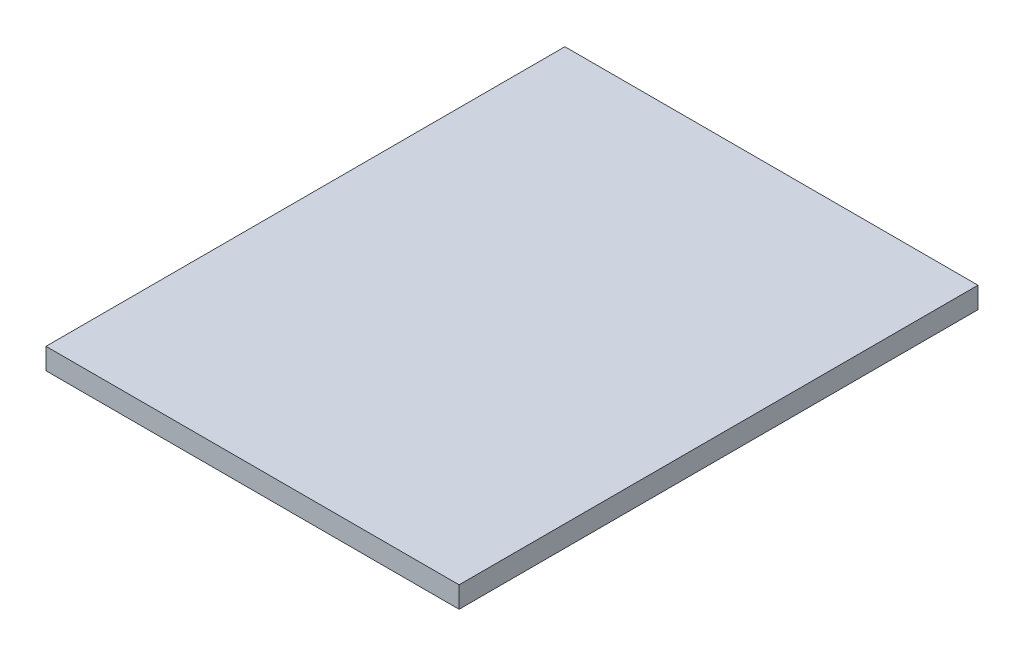
ISO-10303-21;
HEADER;
FILE_DESCRIPTION(('STEP AP214'),'2;1');
FILE_NAME('part.step','',(''),(''),'','','');
FILE_SCHEMA(('AUTOMOTIVE_DESIGN { 1 0 10303 214 1 1 1 1 }'));
ENDSEC;
DATA;
#1=APPLICATION_CONTEXT('core data for automotive mechanical design processes');
#2=APPLICATION_PROTOCOL_DEFINITION('international standard','automotive_design',2000,#1);
#3=PRODUCT_CONTEXT('',#1,'mechanical');
#4=PRODUCT('Part','Part','',(#3));
#5=PRODUCT_RELATED_PRODUCT_CATEGORY('part','',(#4));
#6=PRODUCT_DEFINITION_FORMATION('','',#4);
#7=PRODUCT_DEFINITION_CONTEXT('part definition',#1,'design');
#8=PRODUCT_DEFINITION('design','',#6,#7);
#9=PRODUCT_DEFINITION_SHAPE('','',#8);
#10=(LENGTH_UNIT() NAMED_UNIT(*) SI_UNIT(.MILLI.,.METRE.));
#11=(NAMED_UNIT(*) PLANE_ANGLE_UNIT() SI_UNIT($,.RADIAN.));
#12=(NAMED_UNIT(*) SI_UNIT($,.STERADIAN.) SOLID_ANGLE_UNIT());
#13=UNCERTAINTY_MEASURE_WITH_UNIT(LENGTH_MEASURE(1.E-05),#10,'distance_accuracy_value','');
#14=(GEOMETRIC_REPRESENTATION_CONTEXT(3) GLOBAL_UNCERTAINTY_ASSIGNED_CONTEXT((#13)) GLOBAL_UNIT_ASSIGNED_CONTEXT((#10,
#11,#12)) REPRESENTATION_CONTEXT('',''));
#15=CARTESIAN_POINT('',(0.,0.,0.));
#16=DIRECTION('',(0.,0.,1.));
#17=DIRECTION('',(1.,0.,0.));
#18=AXIS2_PLACEMENT_3D('',#15,#16,#17);
#19=CARTESIAN_POINT('',(-134.737910668143,19.,-163.416666666667));
#20=DIRECTION('',(1.,0.,0.));
#21=DIRECTION('',(0.,0.,-1.));
#22=AXIS2_PLACEMENT_3D('',#19,#20,#21);
#23=PLANE('',#22);
#24=DIRECTION('',(0.,0.,1.));
#25=VECTOR('',#24,1.);
#26=CARTESIAN_POINT('',(-134.737910668143,0.,-163.416666666667));
#27=LINE('',#26,#25);
#28=CARTESIAN_POINT('',(-134.737910668143,0.,-163.416666666667));
#29=VERTEX_POINT('',#28);
#30=CARTESIAN_POINT('',(-134.737910668143,0.,301.363333333333));
#31=VERTEX_POINT('',#30);
#32=EDGE_CURVE('E96',#29,#31,#27,.T.);
#33=ORIENTED_EDGE('',*,*,#32,.T.);
#34=DIRECTION('',(0.,-1.,0.));
#35=VECTOR('',#34,1.);
#36=CARTESIAN_POINT('',(-134.737910668143,19.,301.363333333333));
#37=LINE('',#36,#35);
#38=CARTESIAN_POINT('',(-134.737910668143,19.,301.363333333333));
#39=VERTEX_POINT('',#38);
#40=EDGE_CURVE('E11',#39,#31,#37,.T.);
#41=ORIENTED_EDGE('',*,*,#40,.F.);
#42=DIRECTION('',(0.,0.,1.));
#43=VECTOR('',#42,1.);
#44=CARTESIAN_POINT('',(-134.737910668143,19.,-163.416666666667));
#45=LINE('',#44,#43);
#46=CARTESIAN_POINT('',(-134.737910668143,19.,-163.416666666667));
#47=VERTEX_POINT('',#46);
#48=EDGE_CURVE('E84',#47,#39,#45,.T.);
#49=ORIENTED_EDGE('',*,*,#48,.F.);
#50=DIRECTION('',(0.,-1.,0.));
#51=VECTOR('',#50,1.);
#52=CARTESIAN_POINT('',(-134.737910668143,19.,-163.416666666667));
#53=LINE('',#52,#51);
#54=EDGE_CURVE('E92',#47,#29,#53,.T.);
#55=ORIENTED_EDGE('',*,*,#54,.T.);
#56=EDGE_LOOP('',(#33,#41,#49,#55));
#57=FACE_BOUND('',#56,.T.);
#58=ADVANCED_FACE('F33',(#57),#23,.F.);
#59=CARTESIAN_POINT('',(-134.737910668143,19.,301.363333333333));
#60=DIRECTION('',(0.,0.,-1.));
#61=DIRECTION('',(-1.,0.,0.));
#62=AXIS2_PLACEMENT_3D('',#59,#60,#61);
#63=PLANE('',#62);
#64=DIRECTION('',(1.,0.,0.));
#65=VECTOR('',#64,1.);
#66=CARTESIAN_POINT('',(-134.737910668143,0.,301.363333333333));
#67=LINE('',#66,#65);
#68=CARTESIAN_POINT('',(235.262089331857,0.,301.363333333333));
#69=VERTEX_POINT('',#68);
#70=EDGE_CURVE('E88',#31,#69,#67,.T.);
#71=ORIENTED_EDGE('',*,*,#70,.T.);
#72=DIRECTION('',(0.,-1.,0.));
#73=VECTOR('',#72,1.);
#74=CARTESIAN_POINT('',(235.262089331857,19.,301.363333333333));
#75=LINE('',#74,#73);
#76=CARTESIAN_POINT('',(235.262089331857,19.,301.363333333333));
#77=VERTEX_POINT('',#76);
#78=EDGE_CURVE('E41',#77,#69,#75,.T.);
#79=ORIENTED_EDGE('',*,*,#78,.F.);
#80=DIRECTION('',(1.,0.,0.));
#81=VECTOR('',#80,1.);
#82=CARTESIAN_POINT('',(-134.737910668143,19.,301.363333333333));
#83=LINE('',#82,#81);
#84=EDGE_CURVE('E79',#39,#77,#83,.T.);
#85=ORIENTED_EDGE('',*,*,#84,.F.);
#86=ORIENTED_EDGE('',*,*,#40,.T.);
#87=EDGE_LOOP('',(#71,#79,#85,#86));
#88=FACE_BOUND('',#87,.T.);
#89=ADVANCED_FACE('F87',(#88),#63,.F.);
#90=CARTESIAN_POINT('',(235.262089331857,19.,-163.416666666667));
#91=DIRECTION('',(-1.,0.,0.));
#92=DIRECTION('',(0.,0.,1.));
#93=AXIS2_PLACEMENT_3D('',#90,#91,#92);
#94=PLANE('',#93);
#95=DIRECTION('',(0.,0.,-1.));
#96=VECTOR('',#95,1.);
#97=CARTESIAN_POINT('',(235.262089331857,0.,-163.416666666667));
#98=LINE('',#97,#96);
#99=CARTESIAN_POINT('',(235.262089331857,0.,-163.416666666667));
#100=VERTEX_POINT('',#99);
#101=EDGE_CURVE('E66',#69,#100,#98,.T.);
#102=ORIENTED_EDGE('',*,*,#101,.T.);
#103=DIRECTION('',(0.,-1.,0.));
#104=VECTOR('',#103,1.);
#105=CARTESIAN_POINT('',(235.262089331857,19.,-163.416666666667));
#106=LINE('',#105,#104);
#107=CARTESIAN_POINT('',(235.262089331857,19.,-163.416666666667));
#108=VERTEX_POINT('',#107);
#109=EDGE_CURVE('E89',#108,#100,#106,.T.);
#110=ORIENTED_EDGE('',*,*,#109,.F.);
#111=DIRECTION('',(0.,0.,-1.));
#112=VECTOR('',#111,1.);
#113=CARTESIAN_POINT('',(235.262089331857,19.,-163.416666666667));
#114=LINE('',#113,#112);
#115=EDGE_CURVE('E82',#77,#108,#114,.T.);
#116=ORIENTED_EDGE('',*,*,#115,.F.);
#117=ORIENTED_EDGE('',*,*,#78,.T.);
#118=EDGE_LOOP('',(#102,#110,#116,#117));
#119=FACE_BOUND('',#118,.T.);
#120=ADVANCED_FACE('F90',(#119),#94,.F.);
#121=CARTESIAN_POINT('',(-134.737910668143,19.,-163.416666666667));
#122=DIRECTION('',(0.,0.,1.));
#123=DIRECTION('',(1.,0.,0.));
#124=AXIS2_PLACEMENT_3D('',#121,#122,#123);
#125=PLANE('',#124);
#126=DIRECTION('',(-1.,0.,0.));
#127=VECTOR('',#126,1.);
#128=CARTESIAN_POINT('',(-134.737910668143,0.,-163.416666666667));
#129=LINE('',#128,#127);
#130=EDGE_CURVE('E72',#100,#29,#129,.T.);
#131=ORIENTED_EDGE('',*,*,#130,.T.);
#132=ORIENTED_EDGE('',*,*,#54,.F.);
#133=DIRECTION('',(-1.,0.,0.));
#134=VECTOR('',#133,1.);
#135=CARTESIAN_POINT('',(-134.737910668143,19.,-163.416666666667));
#136=LINE('',#135,#134);
#137=EDGE_CURVE('E49',#108,#47,#136,.T.);
#138=ORIENTED_EDGE('',*,*,#137,.F.);
#139=ORIENTED_EDGE('',*,*,#109,.T.);
#140=EDGE_LOOP('',(#131,#132,#138,#139));
#141=FACE_BOUND('',#140,.T.);
#142=ADVANCED_FACE('F103',(#141),#125,.F.);
#143=CARTESIAN_POINT('',(0.,19.,0.));
#144=DIRECTION('',(0.,1.,0.));
#145=DIRECTION('',(0.,0.,1.));
#146=AXIS2_PLACEMENT_3D('',#143,#144,#145);
#147=PLANE('',#146);
#148=ORIENTED_EDGE('',*,*,#48,.T.);
#149=ORIENTED_EDGE('',*,*,#84,.T.);
#150=ORIENTED_EDGE('',*,*,#115,.T.);
#151=ORIENTED_EDGE('',*,*,#137,.T.);
#152=EDGE_LOOP('',(#148,#149,#150,#151));
#153=FACE_BOUND('',#152,.T.);
#154=ADVANCED_FACE('F80',(#153),#147,.T.);
#155=CARTESIAN_POINT('',(0.,0.,0.));
#156=DIRECTION('',(0.,1.,0.));
#157=DIRECTION('',(0.,0.,1.));
#158=AXIS2_PLACEMENT_3D('',#155,#156,#157);
#159=PLANE('',#158);
#160=ORIENTED_EDGE('',*,*,#32,.F.);
#161=ORIENTED_EDGE('',*,*,#130,.F.);
#162=ORIENTED_EDGE('',*,*,#101,.F.);
#163=ORIENTED_EDGE('',*,*,#70,.F.);
#164=EDGE_LOOP('',(#160,#161,#162,#163));
#165=FACE_BOUND('',#164,.T.);
#166=ADVANCED_FACE('F106',(#165),#159,.F.);
#167=CLOSED_SHELL('',(#58,#89,#120,#142,#154,#166));
#168=MANIFOLD_SOLID_BREP('B2',#167);
#169=ADVANCED_BREP_SHAPE_REPRESENTATION('',(#18,#168),#14);
#170=SHAPE_DEFINITION_REPRESENTATION(#9,#169);
ENDSEC;
END-ISO-10303-21;
